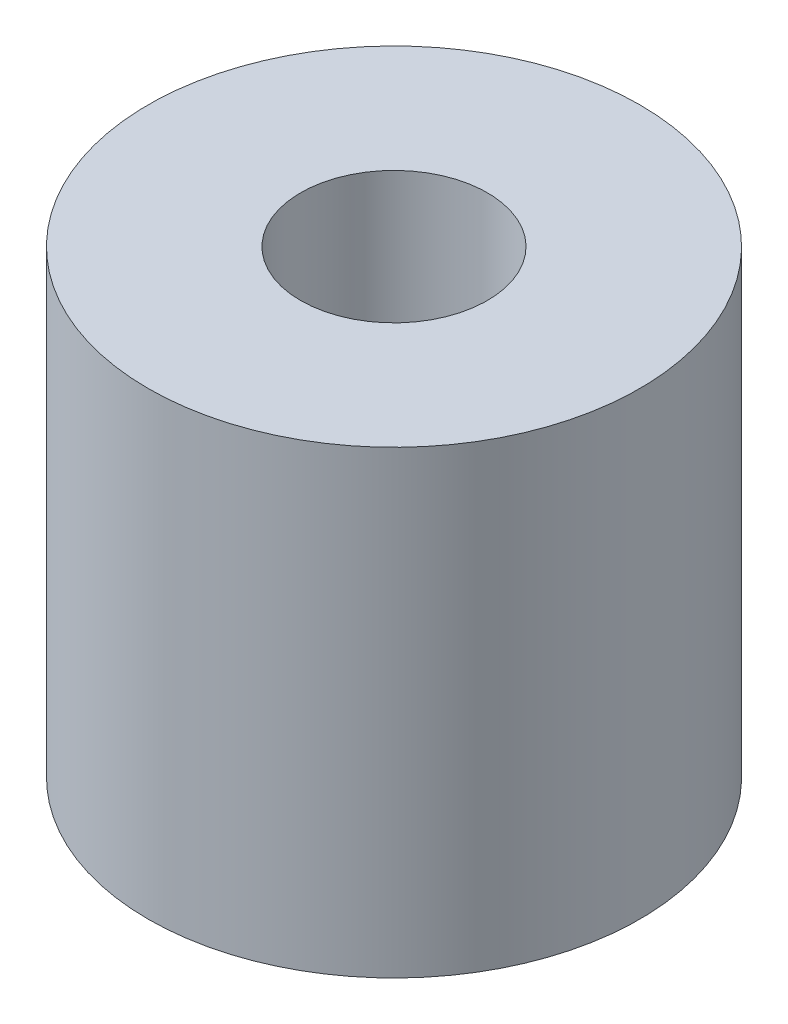
ISO-10303-21;
HEADER;
FILE_DESCRIPTION(('STEP AP214'),'2;1');
FILE_NAME('part.step','',(''),(''),'','','');
FILE_SCHEMA(('AUTOMOTIVE_DESIGN { 1 0 10303 214 1 1 1 1 }'));
ENDSEC;
DATA;
#1=APPLICATION_CONTEXT('core data for automotive mechanical design processes');
#2=APPLICATION_PROTOCOL_DEFINITION('international standard','automotive_design',2000,#1);
#3=PRODUCT_CONTEXT('',#1,'mechanical');
#4=PRODUCT('Part','Part','',(#3));
#5=PRODUCT_RELATED_PRODUCT_CATEGORY('part','',(#4));
#6=PRODUCT_DEFINITION_FORMATION('','',#4);
#7=PRODUCT_DEFINITION_CONTEXT('part definition',#1,'design');
#8=PRODUCT_DEFINITION('design','',#6,#7);
#9=PRODUCT_DEFINITION_SHAPE('','',#8);
#10=(LENGTH_UNIT() NAMED_UNIT(*) SI_UNIT(.MILLI.,.METRE.));
#11=(NAMED_UNIT(*) PLANE_ANGLE_UNIT() SI_UNIT($,.RADIAN.));
#12=(NAMED_UNIT(*) SI_UNIT($,.STERADIAN.) SOLID_ANGLE_UNIT());
#13=UNCERTAINTY_MEASURE_WITH_UNIT(LENGTH_MEASURE(1.E-05),#10,'distance_accuracy_value','');
#14=(GEOMETRIC_REPRESENTATION_CONTEXT(3) GLOBAL_UNCERTAINTY_ASSIGNED_CONTEXT((#13)) GLOBAL_UNIT_ASSIGNED_CONTEXT((#10,
#11,#12)) REPRESENTATION_CONTEXT('',''));
#15=CARTESIAN_POINT('',(0.,0.,0.));
#16=DIRECTION('',(0.,0.,1.));
#17=DIRECTION('',(1.,0.,0.));
#18=AXIS2_PLACEMENT_3D('',#15,#16,#17);
#19=CARTESIAN_POINT('',(0.,9.,0.));
#20=DIRECTION('',(0.,-1.,0.));
#21=DIRECTION('',(0.,0.,-1.));
#22=AXIS2_PLACEMENT_3D('',#19,#20,#21);
#23=CYLINDRICAL_SURFACE('',#22,4.8125);
#24=CARTESIAN_POINT('',(0.,9.,0.));
#25=DIRECTION('',(0.,1.,0.));
#26=DIRECTION('',(0.,0.,1.));
#27=AXIS2_PLACEMENT_3D('',#24,#25,#26);
#28=CIRCLE('',#27,4.8125);
#29=CARTESIAN_POINT('',(0.,9.,4.8125));
#30=VERTEX_POINT('',#29);
#31=EDGE_CURVE('E10',#30,#30,#28,.T.);
#32=ORIENTED_EDGE('',*,*,#31,.F.);
#33=EDGE_LOOP('',(#32));
#34=FACE_BOUND('',#33,.T.);
#35=CARTESIAN_POINT('',(0.,0.,0.));
#36=DIRECTION('',(0.,1.,0.));
#37=DIRECTION('',(0.,0.,1.));
#38=AXIS2_PLACEMENT_3D('',#35,#36,#37);
#39=CIRCLE('',#38,4.8125);
#40=CARTESIAN_POINT('',(0.,0.,4.8125));
#41=VERTEX_POINT('',#40);
#42=EDGE_CURVE('E34',#41,#41,#39,.T.);
#43=ORIENTED_EDGE('',*,*,#42,.T.);
#44=EDGE_LOOP('',(#43));
#45=FACE_BOUND('',#44,.T.);
#46=ADVANCED_FACE('F31',(#34,#45),#23,.T.);
#47=CARTESIAN_POINT('',(0.,9.,0.));
#48=DIRECTION('',(0.,1.,0.));
#49=DIRECTION('',(0.,0.,1.));
#50=AXIS2_PLACEMENT_3D('',#47,#48,#49);
#51=PLANE('',#50);
#52=CARTESIAN_POINT('',(0.,9.,0.));
#53=DIRECTION('',(0.,1.,0.));
#54=DIRECTION('',(0.,0.,1.));
#55=AXIS2_PLACEMENT_3D('',#52,#53,#54);
#56=CIRCLE('',#55,1.82879999999999);
#57=CARTESIAN_POINT('',(0.,9.,1.82879999999999));
#58=VERTEX_POINT('',#57);
#59=EDGE_CURVE('E45',#58,#58,#56,.T.);
#60=ORIENTED_EDGE('',*,*,#59,.F.);
#61=EDGE_LOOP('',(#60));
#62=FACE_BOUND('',#61,.T.);
#63=ORIENTED_EDGE('',*,*,#31,.T.);
#64=EDGE_LOOP('',(#63));
#65=FACE_BOUND('',#64,.T.);
#66=ADVANCED_FACE('F51',(#62,#65),#51,.T.);
#67=CARTESIAN_POINT('',(0.,0.,0.));
#68=DIRECTION('',(0.,1.,0.));
#69=DIRECTION('',(0.,0.,1.));
#70=AXIS2_PLACEMENT_3D('',#67,#68,#69);
#71=PLANE('',#70);
#72=CARTESIAN_POINT('',(0.,0.,0.));
#73=DIRECTION('',(0.,1.,0.));
#74=DIRECTION('',(0.,0.,1.));
#75=AXIS2_PLACEMENT_3D('',#72,#73,#74);
#76=CIRCLE('',#75,1.8288);
#77=CARTESIAN_POINT('',(0.,0.,1.8288));
#78=VERTEX_POINT('',#77);
#79=EDGE_CURVE('E41',#78,#78,#76,.T.);
#80=ORIENTED_EDGE('',*,*,#79,.T.);
#81=EDGE_LOOP('',(#80));
#82=FACE_BOUND('',#81,.T.);
#83=ORIENTED_EDGE('',*,*,#42,.F.);
#84=EDGE_LOOP('',(#83));
#85=FACE_BOUND('',#84,.T.);
#86=ADVANCED_FACE('F53',(#82,#85),#71,.F.);
#87=CARTESIAN_POINT('',(0.,9.,0.));
#88=DIRECTION('',(0.,1.,0.));
#89=DIRECTION('',(0.,0.,1.));
#90=AXIS2_PLACEMENT_3D('',#87,#88,#89);
#91=CYLINDRICAL_SURFACE('',#90,1.82879999999999);
#92=ORIENTED_EDGE('',*,*,#79,.F.);
#93=EDGE_LOOP('',(#92));
#94=FACE_BOUND('',#93,.T.);
#95=ORIENTED_EDGE('',*,*,#59,.T.);
#96=EDGE_LOOP('',(#95));
#97=FACE_BOUND('',#96,.T.);
#98=ADVANCED_FACE('F49',(#94,#97),#91,.F.);
#99=CLOSED_SHELL('',(#46,#66,#86,#98));
#100=MANIFOLD_SOLID_BREP('B2',#99);
#101=ADVANCED_BREP_SHAPE_REPRESENTATION('',(#18,#100),#14);
#102=SHAPE_DEFINITION_REPRESENTATION(#9,#101);
ENDSEC;
END-ISO-10303-21;
